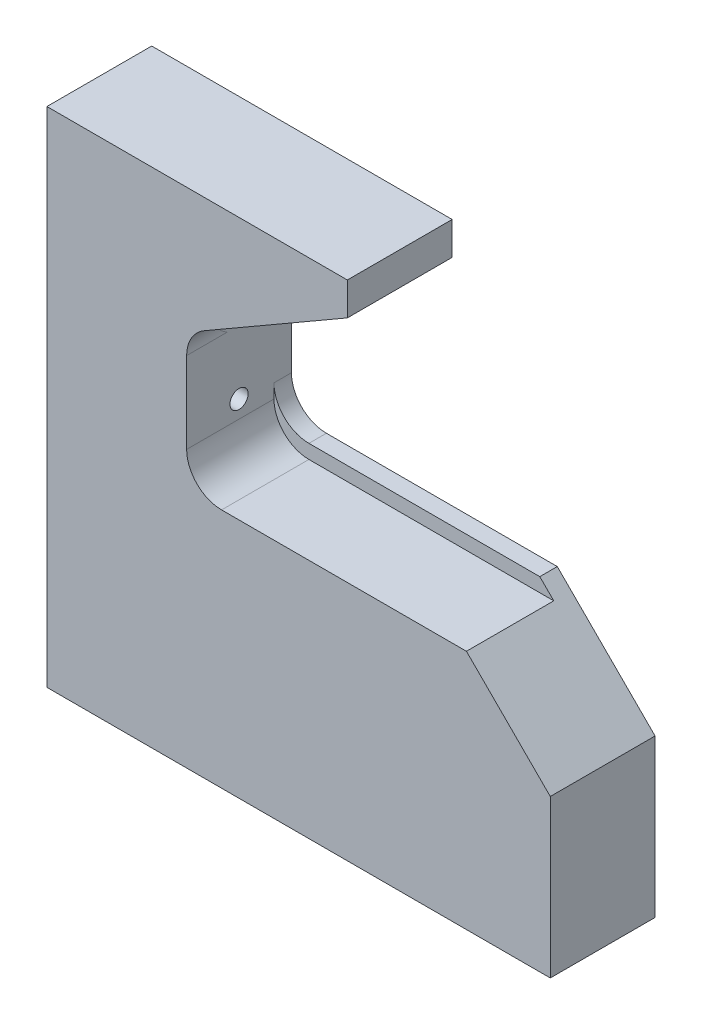
ISO-10303-21;
HEADER;
FILE_DESCRIPTION(('STEP AP214'),'2;1');
FILE_NAME('part.step','',(''),(''),'','','');
FILE_SCHEMA(('AUTOMOTIVE_DESIGN { 1 0 10303 214 1 1 1 1 }'));
ENDSEC;
DATA;
#1=APPLICATION_CONTEXT('core data for automotive mechanical design processes');
#2=APPLICATION_PROTOCOL_DEFINITION('international standard','automotive_design',2000,#1);
#3=PRODUCT_CONTEXT('',#1,'mechanical');
#4=PRODUCT('Part','Part','',(#3));
#5=PRODUCT_RELATED_PRODUCT_CATEGORY('part','',(#4));
#6=PRODUCT_DEFINITION_FORMATION('','',#4);
#7=PRODUCT_DEFINITION_CONTEXT('part definition',#1,'design');
#8=PRODUCT_DEFINITION('design','',#6,#7);
#9=PRODUCT_DEFINITION_SHAPE('','',#8);
#10=(LENGTH_UNIT() NAMED_UNIT(*) SI_UNIT(.MILLI.,.METRE.));
#11=(NAMED_UNIT(*) PLANE_ANGLE_UNIT() SI_UNIT($,.RADIAN.));
#12=(NAMED_UNIT(*) SI_UNIT($,.STERADIAN.) SOLID_ANGLE_UNIT());
#13=UNCERTAINTY_MEASURE_WITH_UNIT(LENGTH_MEASURE(1.E-05),#10,'distance_accuracy_value','');
#14=(GEOMETRIC_REPRESENTATION_CONTEXT(3) GLOBAL_UNCERTAINTY_ASSIGNED_CONTEXT((#13)) GLOBAL_UNIT_ASSIGNED_CONTEXT((#10,
#11,#12)) REPRESENTATION_CONTEXT('',''));
#15=CARTESIAN_POINT('',(0.,0.,0.));
#16=DIRECTION('',(0.,0.,1.));
#17=DIRECTION('',(1.,0.,0.));
#18=AXIS2_PLACEMENT_3D('',#15,#16,#17);
#19=CARTESIAN_POINT('',(-6.29278813620283,-9.525,9.525));
#20=DIRECTION('',(0.,-1.,0.));
#21=DIRECTION('',(0.,0.,1.));
#22=AXIS2_PLACEMENT_3D('',#19,#20,#21);
#23=PLANE('',#22);
#24=DIRECTION('',(-1.,0.,0.));
#25=VECTOR('',#24,1.);
#26=CARTESIAN_POINT('',(0.,-9.525,-6.35));
#27=LINE('',#26,#25);
#28=CARTESIAN_POINT('',(-6.29278813620283,-9.525,-6.34999999999999));
#29=VERTEX_POINT('',#28);
#30=CARTESIAN_POINT('',(-50.8,-9.525,-6.34999999999999));
#31=VERTEX_POINT('',#30);
#32=EDGE_CURVE('E214',#29,#31,#27,.T.);
#33=ORIENTED_EDGE('',*,*,#32,.T.);
#34=DIRECTION('',(0.,0.,-1.));
#35=VECTOR('',#34,1.);
#36=CARTESIAN_POINT('',(-50.8,-9.525,9.525));
#37=LINE('',#36,#35);
#38=CARTESIAN_POINT('',(-50.8,-9.525,9.525));
#39=VERTEX_POINT('',#38);
#40=EDGE_CURVE('E440',#39,#31,#37,.T.);
#41=ORIENTED_EDGE('',*,*,#40,.F.);
#42=DIRECTION('',(-1.,0.,0.));
#43=VECTOR('',#42,1.);
#44=CARTESIAN_POINT('',(-6.29278813620283,-9.525,9.525));
#45=LINE('',#44,#43);
#46=CARTESIAN_POINT('',(-6.29278813620283,-9.525,9.525));
#47=VERTEX_POINT('',#46);
#48=EDGE_CURVE('E378',#47,#39,#45,.T.);
#49=ORIENTED_EDGE('',*,*,#48,.F.);
#50=DIRECTION('',(0.,0.,-1.));
#51=VECTOR('',#50,1.);
#52=CARTESIAN_POINT('',(-6.29278813620283,-9.525,9.525));
#53=LINE('',#52,#51);
#54=EDGE_CURVE('E443',#47,#29,#53,.T.);
#55=ORIENTED_EDGE('',*,*,#54,.T.);
#56=EDGE_LOOP('',(#33,#41,#49,#55));
#57=FACE_BOUND('',#56,.T.);
#58=ADVANCED_FACE('F51',(#57),#23,.F.);
#59=CARTESIAN_POINT('',(-50.8,-3.175,9.525));
#60=DIRECTION('',(0.,0.,-1.));
#61=DIRECTION('',(1.,0.,0.));
#62=AXIS2_PLACEMENT_3D('',#59,#60,#61);
#63=CYLINDRICAL_SURFACE('',#62,6.35);
#64=CARTESIAN_POINT('',(-50.8,-3.175,-6.35));
#65=DIRECTION('',(0.,0.,-1.));
#66=DIRECTION('',(1.,0.,0.));
#67=AXIS2_PLACEMENT_3D('',#64,#65,#66);
#68=CIRCLE('',#67,6.35);
#69=CARTESIAN_POINT('',(-57.15,-3.175,-6.34999999999999));
#70=VERTEX_POINT('',#69);
#71=EDGE_CURVE('E76',#31,#70,#68,.T.);
#72=ORIENTED_EDGE('',*,*,#71,.T.);
#73=DIRECTION('',(0.,0.,-1.));
#74=VECTOR('',#73,1.);
#75=CARTESIAN_POINT('',(-57.15,-3.175,9.525));
#76=LINE('',#75,#74);
#77=CARTESIAN_POINT('',(-57.15,-3.175,9.525));
#78=VERTEX_POINT('',#77);
#79=EDGE_CURVE('E436',#78,#70,#76,.T.);
#80=ORIENTED_EDGE('',*,*,#79,.F.);
#81=CARTESIAN_POINT('',(-50.8,-3.175,9.525));
#82=DIRECTION('',(0.,0.,-1.));
#83=DIRECTION('',(1.,0.,0.));
#84=AXIS2_PLACEMENT_3D('',#81,#82,#83);
#85=CIRCLE('',#84,6.35);
#86=EDGE_CURVE('E382',#39,#78,#85,.T.);
#87=ORIENTED_EDGE('',*,*,#86,.F.);
#88=ORIENTED_EDGE('',*,*,#40,.T.);
#89=EDGE_LOOP('',(#72,#80,#87,#88));
#90=FACE_BOUND('',#89,.T.);
#91=ADVANCED_FACE('F304',(#90),#63,.F.);
#92=CARTESIAN_POINT('',(-50.8,11.593094792873,9.525));
#93=DIRECTION('',(0.,0.,-1.));
#94=DIRECTION('',(1.,0.,0.));
#95=AXIS2_PLACEMENT_3D('',#92,#93,#94);
#96=CYLINDRICAL_SURFACE('',#95,6.35);
#97=CARTESIAN_POINT('',(-53.975,17.0923561069042,4.60428608570136));
#98=CARTESIAN_POINT('',(-54.1113508766374,17.0136414045933,4.62508964887516));
#99=CARTESIAN_POINT('',(-54.2448913914641,16.9297730828273,4.64511225366183));
#100=CARTESIAN_POINT('',(-54.5058268645094,16.751997878483,4.6819390500378));
#101=CARTESIAN_POINT('',(-54.6332137589857,16.6580783163095,4.69873910002061));
#102=CARTESIAN_POINT('',(-54.8818400642926,16.4599753567673,4.72750376481506));
#103=CARTESIAN_POINT('',(-55.003029721475,16.3557241746457,4.73943340216922));
#104=CARTESIAN_POINT('',(-55.2374048178985,16.1381445523192,4.75647541852492));
#105=CARTESIAN_POINT('',(-55.35059476805,16.0248213058547,4.76159166900556));
#106=CARTESIAN_POINT('',(-55.5463264474944,15.8134362028541,4.76302846466305));
#107=CARTESIAN_POINT('',(-55.63046672208,15.7168621875559,4.7609051129015));
#108=CARTESIAN_POINT('',(-55.7925866764744,15.519024406963,4.75021009038339));
#109=CARTESIAN_POINT('',(-55.8705677154356,15.4177616841881,4.74163984667382));
#110=CARTESIAN_POINT('',(-56.0196758943345,15.2116050865912,4.71720819506649));
#111=CARTESIAN_POINT('',(-56.0908230061625,15.1067230909921,4.70136886662639));
#112=CARTESIAN_POINT('',(-56.226094755376,14.8939858242828,4.66162241297098));
#113=CARTESIAN_POINT('',(-56.2902194939784,14.7861305960554,4.63771540405945));
#114=CARTESIAN_POINT('',(-56.4115757674052,14.5677281511387,4.58096849410895));
#115=CARTESIAN_POINT('',(-56.4687496606463,14.4571665022745,4.54806040002896));
#116=CARTESIAN_POINT('',(-56.5754116495449,14.2354894555281,4.4729302555646));
#117=CARTESIAN_POINT('',(-56.6248996425662,14.1243740502716,4.43070808081975));
#118=CARTESIAN_POINT('',(-56.7161808387424,13.9029960870149,4.33671183072896));
#119=CARTESIAN_POINT('',(-56.7579726750404,13.7927336838348,4.2849360619031));
#120=CARTESIAN_POINT('',(-56.8340477039572,13.5745379665484,4.17185512711184));
#121=CARTESIAN_POINT('',(-56.8683315315639,13.4666044561731,4.11055076777488));
#122=CARTESIAN_POINT('',(-56.9264952668409,13.2658985662237,3.98577731950784));
#123=CARTESIAN_POINT('',(-56.9510981150687,13.1727455703258,3.92325300113739));
#124=CARTESIAN_POINT('',(-56.9950956957228,12.9902709148279,3.79109986904151));
#125=CARTESIAN_POINT('',(-57.0144882843248,12.9009508449946,3.72146814709996));
#126=CARTESIAN_POINT('',(-57.0485801618721,12.7269440695261,3.57548014176961));
#127=CARTESIAN_POINT('',(-57.063276399359,12.6422604058874,3.49911952721115));
#128=CARTESIAN_POINT('',(-57.0885466129999,12.4782867137482,3.34017718422799));
#129=CARTESIAN_POINT('',(-57.0991203897732,12.3989969462736,3.2575951551383));
#130=CARTESIAN_POINT('',(-57.1163699495852,12.2498666873862,3.09059466462463));
#131=CARTESIAN_POINT('',(-57.1232004809615,12.1797609557093,3.00642843981754));
#132=CARTESIAN_POINT('',(-57.1342262156432,12.0454423071342,2.83335401028897));
#133=CARTESIAN_POINT('',(-57.13842134248,11.9812295612723,2.74444566805201));
#134=CARTESIAN_POINT('',(-57.1447154769834,11.8592079938995,2.56257298808015));
#135=CARTESIAN_POINT('',(-57.1468193381599,11.8013846224067,2.46961856697297));
#136=CARTESIAN_POINT('',(-57.1494582485168,11.692271159258,2.27995037574595));
#137=CARTESIAN_POINT('',(-57.1499935732039,11.6409799217751,2.18323726884723));
#138=CARTESIAN_POINT('',(-57.15,11.593094792873,2.08487266929629));
#139=B_SPLINE_CURVE_WITH_KNOTS('',3,(#97,#98,#99,#100,#101,#102,#103,#104,#105,#106,#107,#108,
#109,#110,#111,#112,#113,#114,#115,#116,#117,#118,#119,#120,#121,#122,#123,#124,#125,#126,#127,
#128,#129,#130,#131,#132,#133,#134,#135,#136,#137,#138),.UNSPECIFIED.,.F.,.F.,(4,2,2,2,2,2,2,2,
2,2,2,2,2,2,2,2,2,2,2,2,4),(0.,0.476379772374912,0.953367742047326,1.43372342640456,
1.91380604809174,2.29775745889993,2.68162390542814,3.06433201743873,3.44703461255936,
3.83272099070913,4.21841251880887,4.60417248077879,4.98989980458882,5.33407069164746,
5.6783829758579,6.02291852454581,6.36747073444755,6.696430247589,7.02539930533709,
7.35360308069951,7.68174920503093),.UNSPECIFIED.);
#140=CARTESIAN_POINT('',(-53.975,17.0923561069042,4.60428608570136));
#141=VERTEX_POINT('',#140);
#142=CARTESIAN_POINT('',(-57.15,11.593094792873,2.08487266929633));
#143=VERTEX_POINT('',#142);
#144=EDGE_CURVE('E255',#141,#143,#139,.T.);
#145=ORIENTED_EDGE('',*,*,#144,.F.);
#146=DIRECTION('',(0.,0.,-1.));
#147=VECTOR('',#146,1.);
#148=CARTESIAN_POINT('',(-53.975,17.0923561069042,9.525));
#149=LINE('',#148,#147);
#150=CARTESIAN_POINT('',(-53.975,17.0923561069042,9.525));
#151=VERTEX_POINT('',#150);
#152=EDGE_CURVE('E427',#151,#141,#149,.T.);
#153=ORIENTED_EDGE('',*,*,#152,.F.);
#154=CARTESIAN_POINT('',(-50.8,11.593094792873,9.525));
#155=DIRECTION('',(0.,0.,-1.));
#156=DIRECTION('',(1.,0.,0.));
#157=AXIS2_PLACEMENT_3D('',#154,#155,#156);
#158=CIRCLE('',#157,6.35);
#159=CARTESIAN_POINT('',(-57.15,11.593094792873,9.525));
#160=VERTEX_POINT('',#159);
#161=EDGE_CURVE('E389',#160,#151,#158,.T.);
#162=ORIENTED_EDGE('',*,*,#161,.F.);
#163=DIRECTION('',(0.,0.,-1.));
#164=VECTOR('',#163,1.);
#165=CARTESIAN_POINT('',(-57.15,11.593094792873,9.525));
#166=LINE('',#165,#164);
#167=EDGE_CURVE('E432',#160,#143,#166,.T.);
#168=ORIENTED_EDGE('',*,*,#167,.T.);
#169=EDGE_LOOP('',(#145,#153,#162,#168));
#170=FACE_BOUND('',#169,.T.);
#171=ADVANCED_FACE('F261',(#170),#96,.F.);
#172=CARTESIAN_POINT('',(-57.15,11.593094792873,-2.08487266929629));
#173=CARTESIAN_POINT('',(-57.1499896079638,11.6477036663434,-2.19706000854487));
#174=CARTESIAN_POINT('',(-57.149295442611,11.7067505495997,-2.30709883615113));
#175=CARTESIAN_POINT('',(-57.1457738852113,11.8332961099778,-2.52221696693255));
#176=CARTESIAN_POINT('',(-57.1429457661744,11.9007976608766,-2.62729456696358));
#177=CARTESIAN_POINT('',(-57.1343772320195,12.0439969425765,-2.83204549306916));
#178=CARTESIAN_POINT('',(-57.1286284313238,12.1197177767795,-2.93170233840411));
#179=CARTESIAN_POINT('',(-57.1133939144072,12.2786067084437,-3.1245747462868));
#180=CARTESIAN_POINT('',(-57.1039086507198,12.3617739031131,-3.21779108725592));
#181=CARTESIAN_POINT('',(-57.0803422398971,12.5351551675311,-3.39742198609998));
#182=CARTESIAN_POINT('',(-57.0662456746826,12.6253920946448,-3.48381250154185));
#183=CARTESIAN_POINT('',(-57.0326737025964,12.8118004687659,-3.64879482459787));
#184=CARTESIAN_POINT('',(-57.0131986386591,12.9079715371075,-3.72738712899368));
#185=CARTESIAN_POINT('',(-56.9682029671152,13.105035044801,-3.87606811093338));
#186=CARTESIAN_POINT('',(-56.9426946275755,13.2059175740881,-3.94617361383919));
#187=CARTESIAN_POINT('',(-56.8850298855865,13.4114166067748,-4.07762639548657));
#188=CARTESIAN_POINT('',(-56.8528740234818,13.5160328061112,-4.13897438539856));
#189=CARTESIAN_POINT('',(-56.7837993636749,13.7209030425351,-4.24898938784659));
#190=CARTESIAN_POINT('',(-56.7473205959476,13.8210041883582,-4.29821858822719));
#191=CARTESIAN_POINT('',(-56.667991249007,14.0222666730337,-4.388730959138));
#192=CARTESIAN_POINT('',(-56.6251407773086,14.1234279939702,-4.43001426371868));
#193=CARTESIAN_POINT('',(-56.5330307643795,14.3257142433685,-4.50474723452688));
#194=CARTESIAN_POINT('',(-56.4837714841317,14.4268391731441,-4.53819721959182));
#195=CARTESIAN_POINT('',(-56.3789415530392,14.6280210493351,-4.59754832087161));
#196=CARTESIAN_POINT('',(-56.3233708178056,14.7280779814509,-4.62344933613449));
#197=CARTESIAN_POINT('',(-56.2072051739229,14.9243711737376,-4.66772436778048));
#198=CARTESIAN_POINT('',(-56.1467204143452,15.0206438347441,-4.68622707799075));
#199=CARTESIAN_POINT('',(-56.0201375267892,15.2105094311678,-4.71689631806553));
#200=CARTESIAN_POINT('',(-55.9540373588998,15.3041013761087,-4.72906053379707));
#201=CARTESIAN_POINT('',(-55.8164373546782,15.4881018931541,-4.74766096999691));
#202=CARTESIAN_POINT('',(-55.7449270649016,15.5785037805681,-4.75408577746614));
#203=CARTESIAN_POINT('',(-55.5969704685222,15.7554114050622,-4.76182187389247));
#204=CARTESIAN_POINT('',(-55.5205232138835,15.8419163883809,-4.76313217773545));
#205=CARTESIAN_POINT('',(-55.3341426601427,16.0415685182146,-4.76098271199396));
#206=CARTESIAN_POINT('',(-55.2222163043403,16.1528425293162,-4.75559591355604));
#207=CARTESIAN_POINT('',(-54.9906261357071,16.3665643544675,-4.73827779863016));
#208=CARTESIAN_POINT('',(-54.8709575192208,16.469006595147,-4.7263423840558));
#209=CARTESIAN_POINT('',(-54.6253315513067,16.6639723997066,-4.69772225277613));
#210=CARTESIAN_POINT('',(-54.4994083562844,16.7565426640819,-4.68106139941843));
#211=CARTESIAN_POINT('',(-54.2415651757743,16.931860831255,-4.64461374801886));
#212=CARTESIAN_POINT('',(-54.1096531502128,17.0146212728601,-4.6248310174482));
#213=CARTESIAN_POINT('',(-53.975,17.0923561069042,-4.60428608570135));
#214=B_SPLINE_CURVE_WITH_KNOTS('',3,(#172,#173,#174,#175,#176,#177,#178,#179,#180,#181,#182,
#183,#184,#185,#186,#187,#188,#189,#190,#191,#192,#193,#194,#195,#196,#197,#198,#199,#200,#201,
#202,#203,#204,#205,#206,#207,#208,#209,#210,#211,#212,#213),.UNSPECIFIED.,.F.,.F.,(4,2,2,2,2,2,
2,2,2,2,2,2,2,2,2,2,2,2,2,2,4),(0.,0.374235461788785,0.748598474752093,1.12404244831308,
1.49944096476456,1.87610769504882,2.25275041451625,2.6286337546583,3.00448655309735,
3.35613717554868,3.70778186499156,4.05941223904992,4.41104731522638,4.75626757537123,
5.10161378448363,5.44764520681056,5.79374327560947,6.26685501178745,6.74026315682248,
7.21132191576781,7.68177192717215),.UNSPECIFIED.);
#215=CARTESIAN_POINT('',(-57.15,11.593094792873,-2.08487266929633));
#216=VERTEX_POINT('',#215);
#217=CARTESIAN_POINT('',(-53.975,17.0923561069042,-4.60428608570135));
#218=VERTEX_POINT('',#217);
#219=EDGE_CURVE('E245',#216,#218,#214,.T.);
#220=ORIENTED_EDGE('',*,*,#219,.F.);
#221=CARTESIAN_POINT('',(-57.15,11.593094792873,-9.525));
#222=VERTEX_POINT('',#221);
#223=EDGE_CURVE('E431',#216,#222,#166,.T.);
#224=ORIENTED_EDGE('',*,*,#223,.T.);
#225=CARTESIAN_POINT('',(-50.8,11.593094792873,-9.525));
#226=DIRECTION('',(0.,0.,-1.));
#227=DIRECTION('',(1.,0.,0.));
#228=AXIS2_PLACEMENT_3D('',#225,#226,#227);
#229=CIRCLE('',#228,6.35);
#230=CARTESIAN_POINT('',(-53.975,17.0923561069042,-9.525));
#231=VERTEX_POINT('',#230);
#232=EDGE_CURVE('E409',#222,#231,#229,.T.);
#233=ORIENTED_EDGE('',*,*,#232,.T.);
#234=EDGE_CURVE('E426',#218,#231,#149,.T.);
#235=ORIENTED_EDGE('',*,*,#234,.F.);
#236=EDGE_LOOP('',(#220,#224,#233,#235));
#237=FACE_BOUND('',#236,.T.);
#238=ADVANCED_FACE('F327',(#237),#96,.F.);
#239=CARTESIAN_POINT('',(-27.94,38.1,9.525));
#240=DIRECTION('',(0.,-1.,0.));
#241=DIRECTION('',(0.,0.,1.));
#242=AXIS2_PLACEMENT_3D('',#239,#240,#241);
#243=PLANE('',#242);
#244=DIRECTION('',(-1.,0.,0.));
#245=VECTOR('',#244,1.);
#246=CARTESIAN_POINT('',(-27.94,38.1,-9.525));
#247=LINE('',#246,#245);
#248=CARTESIAN_POINT('',(-27.94,38.1,-9.525));
#249=VERTEX_POINT('',#248);
#250=CARTESIAN_POINT('',(-82.55,38.1,-9.525));
#251=VERTEX_POINT('',#250);
#252=EDGE_CURVE('E345',#249,#251,#247,.T.);
#253=ORIENTED_EDGE('',*,*,#252,.T.);
#254=DIRECTION('',(0.,0.,-1.));
#255=VECTOR('',#254,1.);
#256=CARTESIAN_POINT('',(-82.55,38.1,9.525));
#257=LINE('',#256,#255);
#258=CARTESIAN_POINT('',(-82.55,38.1,9.525));
#259=VERTEX_POINT('',#258);
#260=EDGE_CURVE('E61',#259,#251,#257,.T.);
#261=ORIENTED_EDGE('',*,*,#260,.F.);
#262=DIRECTION('',(-1.,0.,0.));
#263=VECTOR('',#262,1.);
#264=CARTESIAN_POINT('',(-27.94,38.1,9.525));
#265=LINE('',#264,#263);
#266=CARTESIAN_POINT('',(-27.94,38.1,9.525));
#267=VERTEX_POINT('',#266);
#268=EDGE_CURVE('E367',#267,#259,#265,.T.);
#269=ORIENTED_EDGE('',*,*,#268,.F.);
#270=DIRECTION('',(0.,0.,-1.));
#271=VECTOR('',#270,1.);
#272=CARTESIAN_POINT('',(-27.94,38.1,9.525));
#273=LINE('',#272,#271);
#274=EDGE_CURVE('E400',#267,#249,#273,.T.);
#275=ORIENTED_EDGE('',*,*,#274,.T.);
#276=EDGE_LOOP('',(#253,#261,#269,#275));
#277=FACE_BOUND('',#276,.T.);
#278=ADVANCED_FACE('F53',(#277),#243,.F.);
#279=CARTESIAN_POINT('',(-82.55,38.1,9.525));
#280=DIRECTION('',(1.,0.,0.));
#281=DIRECTION('',(0.,0.,1.));
#282=AXIS2_PLACEMENT_3D('',#279,#280,#281);
#283=PLANE('',#282);
#284=CARTESIAN_POINT('',(-82.55,0.,0.));
#285=DIRECTION('',(-1.,0.,0.));
#286=DIRECTION('',(0.,0.,1.));
#287=AXIS2_PLACEMENT_3D('',#284,#285,#286);
#288=CIRCLE('',#287,1.64999999999999);
#289=CARTESIAN_POINT('',(-82.55,0.,1.64999999999999));
#290=VERTEX_POINT('',#289);
#291=EDGE_CURVE('E332',#290,#290,#288,.T.);
#292=ORIENTED_EDGE('',*,*,#291,.F.);
#293=EDGE_LOOP('',(#292));
#294=FACE_BOUND('',#293,.T.);
#295=CARTESIAN_POINT('',(-82.55,15.875,0.));
#296=DIRECTION('',(-1.,0.,0.));
#297=DIRECTION('',(0.,0.,-1.));
#298=AXIS2_PLACEMENT_3D('',#295,#296,#297);
#299=CIRCLE('',#298,2.925);
#300=CARTESIAN_POINT('',(-82.55,15.875,-2.925));
#301=VERTEX_POINT('',#300);
#302=EDGE_CURVE('E336',#301,#301,#299,.T.);
#303=ORIENTED_EDGE('',*,*,#302,.F.);
#304=EDGE_LOOP('',(#303));
#305=FACE_BOUND('',#304,.T.);
#306=DIRECTION('',(0.,-1.,0.));
#307=VECTOR('',#306,1.);
#308=CARTESIAN_POINT('',(-82.55,38.1,-9.525));
#309=LINE('',#308,#307);
#310=CARTESIAN_POINT('',(-82.55,-53.34,-9.525));
#311=VERTEX_POINT('',#310);
#312=EDGE_CURVE('E339',#251,#311,#309,.T.);
#313=ORIENTED_EDGE('',*,*,#312,.T.);
#314=DIRECTION('',(0.,0.,-1.));
#315=VECTOR('',#314,1.);
#316=CARTESIAN_POINT('',(-82.55,-53.34,105.009568406882));
#317=LINE('',#316,#315);
#318=CARTESIAN_POINT('',(-82.55,-53.34,9.52500000000001));
#319=VERTEX_POINT('',#318);
#320=EDGE_CURVE('E199',#319,#311,#317,.T.);
#321=ORIENTED_EDGE('',*,*,#320,.F.);
#322=DIRECTION('',(0.,-1.,0.));
#323=VECTOR('',#322,1.);
#324=CARTESIAN_POINT('',(-82.55,38.1,9.525));
#325=LINE('',#324,#323);
#326=EDGE_CURVE('E363',#259,#319,#325,.T.);
#327=ORIENTED_EDGE('',*,*,#326,.F.);
#328=ORIENTED_EDGE('',*,*,#260,.T.);
#329=EDGE_LOOP('',(#313,#321,#327,#328));
#330=FACE_BOUND('',#329,.T.);
#331=ADVANCED_FACE('F318',(#294,#305,#330),#283,.F.);
#332=CARTESIAN_POINT('',(8.94721186379732,-26.035,9.525));
#333=DIRECTION('',(-1.,0.,0.));
#334=DIRECTION('',(0.,-1.,0.));
#335=AXIS2_PLACEMENT_3D('',#332,#333,#334);
#336=PLANE('',#335);
#337=DIRECTION('',(0.,1.,0.));
#338=VECTOR('',#337,1.);
#339=CARTESIAN_POINT('',(8.94721186379732,-26.035,-9.525));
#340=LINE('',#339,#338);
#341=CARTESIAN_POINT('',(8.94721186379733,-53.34,-9.525));
#342=VERTEX_POINT('',#341);
#343=CARTESIAN_POINT('',(8.94721186379732,-24.765,-9.525));
#344=VERTEX_POINT('',#343);
#345=EDGE_CURVE('E344',#342,#344,#340,.T.);
#346=ORIENTED_EDGE('',*,*,#345,.T.);
#347=DIRECTION('',(0.,0.,-1.));
#348=VECTOR('',#347,1.);
#349=CARTESIAN_POINT('',(8.94721186379732,-24.765,9.525));
#350=LINE('',#349,#348);
#351=CARTESIAN_POINT('',(8.94721186379732,-24.765,9.525));
#352=VERTEX_POINT('',#351);
#353=EDGE_CURVE('E360',#352,#344,#350,.T.);
#354=ORIENTED_EDGE('',*,*,#353,.F.);
#355=DIRECTION('',(0.,1.,0.));
#356=VECTOR('',#355,1.);
#357=CARTESIAN_POINT('',(8.94721186379732,-26.035,9.525));
#358=LINE('',#357,#356);
#359=CARTESIAN_POINT('',(8.94721186379733,-53.34,9.52500000000001));
#360=VERTEX_POINT('',#359);
#361=EDGE_CURVE('E359',#360,#352,#358,.T.);
#362=ORIENTED_EDGE('',*,*,#361,.F.);
#363=DIRECTION('',(0.,0.,-1.));
#364=VECTOR('',#363,1.);
#365=CARTESIAN_POINT('',(8.94721186379733,-53.34,105.009568406882));
#366=LINE('',#365,#364);
#367=EDGE_CURVE('E188',#360,#342,#366,.T.);
#368=ORIENTED_EDGE('',*,*,#367,.T.);
#369=EDGE_LOOP('',(#346,#354,#362,#368));
#370=FACE_BOUND('',#369,.T.);
#371=ADVANCED_FACE('F316',(#370),#336,.F.);
#372=CARTESIAN_POINT('',(8.94721186379732,-24.765,9.525));
#373=DIRECTION('',(-0.707106781186544,-0.707106781186551,0.));
#374=DIRECTION('',(0.707106781186551,-0.707106781186544,0.));
#375=AXIS2_PLACEMENT_3D('',#372,#373,#374);
#376=PLANE('',#375);
#377=DIRECTION('',(-0.707106781186551,0.707106781186544,0.));
#378=VECTOR('',#377,1.);
#379=CARTESIAN_POINT('',(8.94721186379732,-24.765,-9.525));
#380=LINE('',#379,#378);
#381=CARTESIAN_POINT('',(-8.83278813620267,-6.985,-9.52500000000001));
#382=VERTEX_POINT('',#381);
#383=EDGE_CURVE('E353',#344,#382,#380,.T.);
#384=ORIENTED_EDGE('',*,*,#383,.T.);
#385=DIRECTION('',(0.,0.,1.));
#386=VECTOR('',#385,1.);
#387=CARTESIAN_POINT('',(-8.83278813620267,-6.985,-61.1533652516633));
#388=LINE('',#387,#386);
#389=CARTESIAN_POINT('',(-8.83278813620267,-6.985,-6.35));
#390=VERTEX_POINT('',#389);
#391=EDGE_CURVE('E210',#382,#390,#388,.T.);
#392=ORIENTED_EDGE('',*,*,#391,.T.);
#393=DIRECTION('',(0.707106781186525,-0.70710678118657,0.));
#394=VECTOR('',#393,1.);
#395=CARTESIAN_POINT('',(-7.90889406810161,-7.90889406810112,-6.35));
#396=LINE('',#395,#394);
#397=EDGE_CURVE('E68',#390,#29,#396,.T.);
#398=ORIENTED_EDGE('',*,*,#397,.T.);
#399=ORIENTED_EDGE('',*,*,#54,.F.);
#400=DIRECTION('',(-0.707106781186551,0.707106781186544,0.));
#401=VECTOR('',#400,1.);
#402=CARTESIAN_POINT('',(8.94721186379732,-24.765,9.525));
#403=LINE('',#402,#401);
#404=EDGE_CURVE('E362',#352,#47,#403,.T.);
#405=ORIENTED_EDGE('',*,*,#404,.F.);
#406=ORIENTED_EDGE('',*,*,#353,.T.);
#407=EDGE_LOOP('',(#384,#392,#398,#399,#405,#406));
#408=FACE_BOUND('',#407,.T.);
#409=ADVANCED_FACE('F301',(#408),#376,.F.);
#410=CARTESIAN_POINT('',(-57.15,-3.175,9.525));
#411=DIRECTION('',(-1.,0.,0.));
#412=DIRECTION('',(0.,0.,-1.));
#413=AXIS2_PLACEMENT_3D('',#410,#411,#412);
#414=PLANE('',#413);
#415=CARTESIAN_POINT('',(-57.15,0.,0.));
#416=DIRECTION('',(-1.,0.,0.));
#417=DIRECTION('',(0.,0.,1.));
#418=AXIS2_PLACEMENT_3D('',#415,#416,#417);
#419=CIRCLE('',#418,1.64999999999998);
#420=CARTESIAN_POINT('',(-57.15,0.,1.64999999999998));
#421=VERTEX_POINT('',#420);
#422=EDGE_CURVE('E55',#421,#421,#419,.T.);
#423=ORIENTED_EDGE('',*,*,#422,.T.);
#424=EDGE_LOOP('',(#423));
#425=FACE_BOUND('',#424,.T.);
#426=DIRECTION('',(0.,1.,0.));
#427=VECTOR('',#426,1.);
#428=CARTESIAN_POINT('',(-57.15,-1.56125112837913E-13,-6.35));
#429=LINE('',#428,#427);
#430=CARTESIAN_POINT('',(-57.15,-0.635000000000004,-6.35));
#431=VERTEX_POINT('',#430);
#432=EDGE_CURVE('E220',#70,#431,#429,.T.);
#433=ORIENTED_EDGE('',*,*,#432,.T.);
#434=DIRECTION('',(0.,0.,1.));
#435=VECTOR('',#434,1.);
#436=CARTESIAN_POINT('',(-57.15,-0.635000000000004,-61.1533652516633));
#437=LINE('',#436,#435);
#438=CARTESIAN_POINT('',(-57.15,-0.635000000000004,-9.525));
#439=VERTEX_POINT('',#438);
#440=EDGE_CURVE('E233',#439,#431,#437,.T.);
#441=ORIENTED_EDGE('',*,*,#440,.F.);
#442=DIRECTION('',(0.,1.,0.));
#443=VECTOR('',#442,1.);
#444=CARTESIAN_POINT('',(-57.15,-3.175,-9.525));
#445=LINE('',#444,#443);
#446=EDGE_CURVE('E406',#439,#222,#445,.T.);
#447=ORIENTED_EDGE('',*,*,#446,.T.);
#448=ORIENTED_EDGE('',*,*,#223,.F.);
#449=CARTESIAN_POINT('',(-57.15,15.875,0.));
#450=DIRECTION('',(-1.,0.,0.));
#451=DIRECTION('',(0.,0.,-1.));
#452=AXIS2_PLACEMENT_3D('',#449,#450,#451);
#453=CIRCLE('',#452,4.7625);
#454=EDGE_CURVE('E230',#143,#216,#453,.T.);
#455=ORIENTED_EDGE('',*,*,#454,.F.);
#456=ORIENTED_EDGE('',*,*,#167,.F.);
#457=DIRECTION('',(0.,1.,0.));
#458=VECTOR('',#457,1.);
#459=CARTESIAN_POINT('',(-57.15,-3.175,9.525));
#460=LINE('',#459,#458);
#461=EDGE_CURVE('E386',#78,#160,#460,.T.);
#462=ORIENTED_EDGE('',*,*,#461,.F.);
#463=ORIENTED_EDGE('',*,*,#79,.T.);
#464=EDGE_LOOP('',(#433,#441,#447,#448,#455,#456,#462,#463));
#465=FACE_BOUND('',#464,.T.);
#466=CARTESIAN_POINT('',(-57.15,15.875,0.));
#467=DIRECTION('',(-1.,0.,0.));
#468=DIRECTION('',(0.,0.,-1.));
#469=AXIS2_PLACEMENT_3D('',#466,#467,#468);
#470=CIRCLE('',#469,2.89999999999998);
#471=CARTESIAN_POINT('',(-57.15,15.875,-2.89999999999998));
#472=VERTEX_POINT('',#471);
#473=EDGE_CURVE('E244',#472,#472,#470,.F.);
#474=ORIENTED_EDGE('',*,*,#473,.F.);
#475=EDGE_LOOP('',(#474));
#476=FACE_BOUND('',#475,.T.);
#477=ADVANCED_FACE('F295',(#425,#465,#476),#414,.F.);
#478=CARTESIAN_POINT('',(-53.975,17.0923561069042,9.525));
#479=DIRECTION('',(-0.500000000000001,0.866025403784438,0.));
#480=DIRECTION('',(-0.866025403784438,-0.500000000000001,0.));
#481=AXIS2_PLACEMENT_3D('',#478,#479,#480);
#482=PLANE('',#481);
#483=CARTESIAN_POINT('',(-56.0835226280623,15.875,0.));
#484=DIRECTION('',(-0.500000000000001,0.866025403784438,0.));
#485=DIRECTION('',(0.866025403784438,0.500000000000001,0.));
#486=AXIS2_PLACEMENT_3D('',#483,#484,#485);
#487=ELLIPSE('',#486,9.52499999999998,4.7625);
#488=EDGE_CURVE('E11',#218,#141,#487,.F.);
#489=ORIENTED_EDGE('',*,*,#488,.F.);
#490=ORIENTED_EDGE('',*,*,#234,.T.);
#491=DIRECTION('',(0.866025403784438,0.500000000000001,0.));
#492=VECTOR('',#491,1.);
#493=CARTESIAN_POINT('',(-53.975,17.0923561069042,-9.525));
#494=LINE('',#493,#492);
#495=CARTESIAN_POINT('',(-27.94,32.1236703652562,-9.525));
#496=VERTEX_POINT('',#495);
#497=EDGE_CURVE('E413',#231,#496,#494,.T.);
#498=ORIENTED_EDGE('',*,*,#497,.T.);
#499=DIRECTION('',(0.,0.,-1.));
#500=VECTOR('',#499,1.);
#501=CARTESIAN_POINT('',(-27.94,32.1236703652562,9.525));
#502=LINE('',#501,#500);
#503=CARTESIAN_POINT('',(-27.94,32.1236703652562,9.525));
#504=VERTEX_POINT('',#503);
#505=EDGE_CURVE('E422',#504,#496,#502,.T.);
#506=ORIENTED_EDGE('',*,*,#505,.F.);
#507=DIRECTION('',(0.866025403784438,0.500000000000001,0.));
#508=VECTOR('',#507,1.);
#509=CARTESIAN_POINT('',(-53.975,17.0923561069042,9.525));
#510=LINE('',#509,#508);
#511=EDGE_CURVE('E393',#151,#504,#510,.T.);
#512=ORIENTED_EDGE('',*,*,#511,.F.);
#513=ORIENTED_EDGE('',*,*,#152,.T.);
#514=EDGE_LOOP('',(#489,#490,#498,#506,#512,#513));
#515=FACE_BOUND('',#514,.T.);
#516=ADVANCED_FACE('F292',(#515),#482,.F.);
#517=CARTESIAN_POINT('',(-27.94,32.1236703652562,9.525));
#518=DIRECTION('',(-1.,0.,0.));
#519=DIRECTION('',(0.,-1.,0.));
#520=AXIS2_PLACEMENT_3D('',#517,#518,#519);
#521=PLANE('',#520);
#522=DIRECTION('',(0.,1.,0.));
#523=VECTOR('',#522,1.);
#524=CARTESIAN_POINT('',(-27.94,32.1236703652562,-9.525));
#525=LINE('',#524,#523);
#526=EDGE_CURVE('E372',#496,#249,#525,.T.);
#527=ORIENTED_EDGE('',*,*,#526,.T.);
#528=ORIENTED_EDGE('',*,*,#274,.F.);
#529=DIRECTION('',(0.,1.,0.));
#530=VECTOR('',#529,1.);
#531=CARTESIAN_POINT('',(-27.94,32.1236703652562,9.525));
#532=LINE('',#531,#530);
#533=EDGE_CURVE('E397',#504,#267,#532,.T.);
#534=ORIENTED_EDGE('',*,*,#533,.F.);
#535=ORIENTED_EDGE('',*,*,#505,.T.);
#536=EDGE_LOOP('',(#527,#528,#534,#535));
#537=FACE_BOUND('',#536,.T.);
#538=ADVANCED_FACE('F286',(#537),#521,.F.);
#539=CARTESIAN_POINT('',(-50.8,-3.175,9.525));
#540=DIRECTION('',(0.,0.,-1.));
#541=DIRECTION('',(1.,0.,0.));
#542=AXIS2_PLACEMENT_3D('',#539,#540,#541);
#543=PLANE('',#542);
#544=ORIENTED_EDGE('',*,*,#268,.T.);
#545=ORIENTED_EDGE('',*,*,#326,.T.);
#546=DIRECTION('',(1.,0.,0.));
#547=VECTOR('',#546,1.);
#548=CARTESIAN_POINT('',(-50.8,-53.34,9.52500000000001));
#549=LINE('',#548,#547);
#550=EDGE_CURVE('E195',#319,#360,#549,.T.);
#551=ORIENTED_EDGE('',*,*,#550,.T.);
#552=ORIENTED_EDGE('',*,*,#361,.T.);
#553=ORIENTED_EDGE('',*,*,#404,.T.);
#554=ORIENTED_EDGE('',*,*,#48,.T.);
#555=ORIENTED_EDGE('',*,*,#86,.T.);
#556=ORIENTED_EDGE('',*,*,#461,.T.);
#557=ORIENTED_EDGE('',*,*,#161,.T.);
#558=ORIENTED_EDGE('',*,*,#511,.T.);
#559=ORIENTED_EDGE('',*,*,#533,.T.);
#560=EDGE_LOOP('',(#544,#545,#551,#552,#553,#554,#555,#556,#557,#558,#559));
#561=FACE_BOUND('',#560,.T.);
#562=ADVANCED_FACE('F283',(#561),#543,.F.);
#563=CARTESIAN_POINT('',(-50.8,-3.175,-9.525));
#564=DIRECTION('',(0.,0.,-1.));
#565=DIRECTION('',(1.,0.,0.));
#566=AXIS2_PLACEMENT_3D('',#563,#564,#565);
#567=PLANE('',#566);
#568=ORIENTED_EDGE('',*,*,#252,.F.);
#569=ORIENTED_EDGE('',*,*,#526,.F.);
#570=ORIENTED_EDGE('',*,*,#497,.F.);
#571=ORIENTED_EDGE('',*,*,#232,.F.);
#572=ORIENTED_EDGE('',*,*,#446,.F.);
#573=CARTESIAN_POINT('',(-50.8,-0.635000000000004,-9.525));
#574=DIRECTION('',(0.,0.,-1.));
#575=DIRECTION('',(1.,0.,0.));
#576=AXIS2_PLACEMENT_3D('',#573,#574,#575);
#577=CIRCLE('',#576,6.35);
#578=CARTESIAN_POINT('',(-50.8,-6.985,-9.52500000000001));
#579=VERTEX_POINT('',#578);
#580=EDGE_CURVE('E198',#579,#439,#577,.T.);
#581=ORIENTED_EDGE('',*,*,#580,.F.);
#582=DIRECTION('',(1.,0.,0.));
#583=VECTOR('',#582,1.);
#584=CARTESIAN_POINT('',(0.,-6.985,-9.525));
#585=LINE('',#584,#583);
#586=EDGE_CURVE('E227',#579,#382,#585,.T.);
#587=ORIENTED_EDGE('',*,*,#586,.T.);
#588=ORIENTED_EDGE('',*,*,#383,.F.);
#589=ORIENTED_EDGE('',*,*,#345,.F.);
#590=DIRECTION('',(-1.,0.,0.));
#591=VECTOR('',#590,1.);
#592=CARTESIAN_POINT('',(-50.8,-53.34,-9.525));
#593=LINE('',#592,#591);
#594=EDGE_CURVE('E180',#342,#311,#593,.T.);
#595=ORIENTED_EDGE('',*,*,#594,.T.);
#596=ORIENTED_EDGE('',*,*,#312,.F.);
#597=EDGE_LOOP('',(#568,#569,#570,#571,#572,#581,#587,#588,#589,#595,#596));
#598=FACE_BOUND('',#597,.T.);
#599=ADVANCED_FACE('F281',(#598),#567,.T.);
#600=CARTESIAN_POINT('',(-82.55,15.875,0.));
#601=DIRECTION('',(-1.,0.,0.));
#602=DIRECTION('',(0.,0.,-1.));
#603=AXIS2_PLACEMENT_3D('',#600,#601,#602);
#604=CYLINDRICAL_SURFACE('',#603,2.89999999999998);
#605=ORIENTED_EDGE('',*,*,#473,.T.);
#606=EDGE_LOOP('',(#605));
#607=FACE_BOUND('',#606,.T.);
#608=CARTESIAN_POINT('',(-82.525,15.875,0.));
#609=DIRECTION('',(-1.,0.,0.));
#610=DIRECTION('',(0.,0.,-1.));
#611=AXIS2_PLACEMENT_3D('',#608,#609,#610);
#612=CIRCLE('',#611,2.89999999999998);
#613=CARTESIAN_POINT('',(-82.525,15.875,-2.89999999999998));
#614=VERTEX_POINT('',#613);
#615=EDGE_CURVE('E402',#614,#614,#612,.T.);
#616=ORIENTED_EDGE('',*,*,#615,.T.);
#617=EDGE_LOOP('',(#616));
#618=FACE_BOUND('',#617,.T.);
#619=ADVANCED_FACE('F277',(#607,#618),#604,.F.);
#620=CARTESIAN_POINT('',(-82.55,15.875,0.));
#621=DIRECTION('',(-1.,0.,0.));
#622=DIRECTION('',(0.,0.,-1.));
#623=AXIS2_PLACEMENT_3D('',#620,#621,#622);
#624=CONICAL_SURFACE('',#623,2.925,0.785398163397275);
#625=ORIENTED_EDGE('',*,*,#615,.F.);
#626=EDGE_LOOP('',(#625));
#627=FACE_BOUND('',#626,.T.);
#628=ORIENTED_EDGE('',*,*,#302,.T.);
#629=EDGE_LOOP('',(#628));
#630=FACE_BOUND('',#629,.T.);
#631=ADVANCED_FACE('F271',(#627,#630),#624,.F.);
#632=CARTESIAN_POINT('',(-70.6203841816037,15.875,0.));
#633=DIRECTION('',(1.,0.,0.));
#634=DIRECTION('',(0.,0.,1.));
#635=AXIS2_PLACEMENT_3D('',#632,#633,#634);
#636=CYLINDRICAL_SURFACE('',#635,4.7625);
#637=ORIENTED_EDGE('',*,*,#144,.T.);
#638=ORIENTED_EDGE('',*,*,#454,.T.);
#639=ORIENTED_EDGE('',*,*,#219,.T.);
#640=ORIENTED_EDGE('',*,*,#488,.T.);
#641=EDGE_LOOP('',(#637,#638,#639,#640));
#642=FACE_BOUND('',#641,.T.);
#643=ADVANCED_FACE('F265',(#642),#636,.F.);
#644=CARTESIAN_POINT('',(-50.8,-0.635000000000004,-61.1533652516633));
#645=DIRECTION('',(0.,0.,1.));
#646=DIRECTION('',(-1.,0.,0.));
#647=AXIS2_PLACEMENT_3D('',#644,#645,#646);
#648=CYLINDRICAL_SURFACE('',#647,6.35);
#649=DIRECTION('',(0.,0.,1.));
#650=VECTOR('',#649,1.);
#651=CARTESIAN_POINT('',(-50.8,-6.985,-61.1533652516633));
#652=LINE('',#651,#650);
#653=CARTESIAN_POINT('',(-50.8,-6.985,-6.35));
#654=VERTEX_POINT('',#653);
#655=EDGE_CURVE('E211',#579,#654,#652,.T.);
#656=ORIENTED_EDGE('',*,*,#655,.F.);
#657=ORIENTED_EDGE('',*,*,#580,.T.);
#658=ORIENTED_EDGE('',*,*,#440,.T.);
#659=CARTESIAN_POINT('',(-50.8,-0.635000000000004,-6.35));
#660=DIRECTION('',(0.,0.,-1.));
#661=DIRECTION('',(1.,0.,0.));
#662=AXIS2_PLACEMENT_3D('',#659,#660,#661);
#663=CIRCLE('',#662,6.35);
#664=EDGE_CURVE('E224',#654,#431,#663,.T.);
#665=ORIENTED_EDGE('',*,*,#664,.F.);
#666=EDGE_LOOP('',(#656,#657,#658,#665));
#667=FACE_BOUND('',#666,.T.);
#668=ADVANCED_FACE('F270',(#667),#648,.F.);
#669=CARTESIAN_POINT('',(0.,-6.985,-61.1533652516633));
#670=DIRECTION('',(0.,-1.,0.));
#671=DIRECTION('',(0.,0.,1.));
#672=AXIS2_PLACEMENT_3D('',#669,#670,#671);
#673=PLANE('',#672);
#674=ORIENTED_EDGE('',*,*,#586,.F.);
#675=ORIENTED_EDGE('',*,*,#655,.T.);
#676=DIRECTION('',(1.,0.,0.));
#677=VECTOR('',#676,1.);
#678=CARTESIAN_POINT('',(0.,-6.985,-6.35));
#679=LINE('',#678,#677);
#680=EDGE_CURVE('E207',#654,#390,#679,.T.);
#681=ORIENTED_EDGE('',*,*,#680,.T.);
#682=ORIENTED_EDGE('',*,*,#391,.F.);
#683=EDGE_LOOP('',(#674,#675,#681,#682));
#684=FACE_BOUND('',#683,.T.);
#685=ADVANCED_FACE('F508',(#684),#673,.F.);
#686=CARTESIAN_POINT('',(-50.8,-0.635000000000004,-6.35));
#687=DIRECTION('',(0.,0.,-1.));
#688=DIRECTION('',(1.,0.,0.));
#689=AXIS2_PLACEMENT_3D('',#686,#687,#688);
#690=PLANE('',#689);
#691=ORIENTED_EDGE('',*,*,#664,.T.);
#692=ORIENTED_EDGE('',*,*,#432,.F.);
#693=ORIENTED_EDGE('',*,*,#71,.F.);
#694=ORIENTED_EDGE('',*,*,#32,.F.);
#695=ORIENTED_EDGE('',*,*,#397,.F.);
#696=ORIENTED_EDGE('',*,*,#680,.F.);
#697=EDGE_LOOP('',(#691,#692,#693,#694,#695,#696));
#698=FACE_BOUND('',#697,.T.);
#699=ADVANCED_FACE('F502',(#698),#690,.F.);
#700=CARTESIAN_POINT('',(-50.8,-53.34,105.009568406882));
#701=DIRECTION('',(0.,-1.,0.));
#702=DIRECTION('',(1.,0.,0.));
#703=AXIS2_PLACEMENT_3D('',#700,#701,#702);
#704=PLANE('',#703);
#705=CARTESIAN_POINT('',(-50.8,-53.34,0.));
#706=DIRECTION('',(0.,-1.,0.));
#707=DIRECTION('',(0.,0.,-1.));
#708=AXIS2_PLACEMENT_3D('',#705,#706,#707);
#709=CIRCLE('',#708,2.525);
#710=CARTESIAN_POINT('',(-50.8,-53.34,-2.525));
#711=VERTEX_POINT('',#710);
#712=EDGE_CURVE('E191',#711,#711,#709,.T.);
#713=ORIENTED_EDGE('',*,*,#712,.F.);
#714=EDGE_LOOP('',(#713));
#715=FACE_BOUND('',#714,.T.);
#716=ORIENTED_EDGE('',*,*,#550,.F.);
#717=ORIENTED_EDGE('',*,*,#320,.T.);
#718=ORIENTED_EDGE('',*,*,#594,.F.);
#719=ORIENTED_EDGE('',*,*,#367,.F.);
#720=EDGE_LOOP('',(#716,#717,#718,#719));
#721=FACE_BOUND('',#720,.T.);
#722=ADVANCED_FACE('F173',(#715,#721),#704,.T.);
#723=CARTESIAN_POINT('',(-50.8,-41.148,0.));
#724=DIRECTION('',(0.,-1.,0.));
#725=DIRECTION('',(0.,0.,-1.));
#726=AXIS2_PLACEMENT_3D('',#723,#724,#725);
#727=CONICAL_SURFACE('',#726,2.1,1.02974425867665);
#728=CARTESIAN_POINT('',(-50.8,-39.8861927000421,0.));
#729=VERTEX_POINT('',#728);
#730=VERTEX_LOOP('',#729);
#731=FACE_BOUND('',#730,.T.);
#732=CARTESIAN_POINT('',(-50.8,-41.148,0.));
#733=DIRECTION('',(0.,-1.,0.));
#734=DIRECTION('',(0.,0.,-1.));
#735=AXIS2_PLACEMENT_3D('',#732,#733,#734);
#736=CIRCLE('',#735,2.1);
#737=CARTESIAN_POINT('',(-50.8,-41.148,-2.1));
#738=VERTEX_POINT('',#737);
#739=EDGE_CURVE('E177',#738,#738,#736,.T.);
#740=ORIENTED_EDGE('',*,*,#739,.T.);
#741=EDGE_LOOP('',(#740));
#742=FACE_BOUND('',#741,.T.);
#743=ADVANCED_FACE('F169',(#731,#742),#727,.F.);
#744=CARTESIAN_POINT('',(-50.8,-53.34,0.));
#745=DIRECTION('',(0.,-1.,0.));
#746=DIRECTION('',(0.,0.,-1.));
#747=AXIS2_PLACEMENT_3D('',#744,#745,#746);
#748=CYLINDRICAL_SURFACE('',#747,2.1);
#749=ORIENTED_EDGE('',*,*,#739,.F.);
#750=EDGE_LOOP('',(#749));
#751=FACE_BOUND('',#750,.T.);
#752=CARTESIAN_POINT('',(-50.8,-52.915,0.));
#753=DIRECTION('',(0.,-1.,0.));
#754=DIRECTION('',(0.,0.,-1.));
#755=AXIS2_PLACEMENT_3D('',#752,#753,#754);
#756=CIRCLE('',#755,2.1);
#757=CARTESIAN_POINT('',(-50.8,-52.915,-2.1));
#758=VERTEX_POINT('',#757);
#759=EDGE_CURVE('E181',#758,#758,#756,.T.);
#760=ORIENTED_EDGE('',*,*,#759,.T.);
#761=EDGE_LOOP('',(#760));
#762=FACE_BOUND('',#761,.T.);
#763=ADVANCED_FACE('F172',(#751,#762),#748,.F.);
#764=CARTESIAN_POINT('',(-50.8,-53.34,0.));
#765=DIRECTION('',(0.,-1.,0.));
#766=DIRECTION('',(0.,0.,-1.));
#767=AXIS2_PLACEMENT_3D('',#764,#765,#766);
#768=CONICAL_SURFACE('',#767,2.525,0.785398163397448);
#769=ORIENTED_EDGE('',*,*,#759,.F.);
#770=EDGE_LOOP('',(#769));
#771=FACE_BOUND('',#770,.T.);
#772=ORIENTED_EDGE('',*,*,#712,.T.);
#773=EDGE_LOOP('',(#772));
#774=FACE_BOUND('',#773,.T.);
#775=ADVANCED_FACE('F499',(#771,#774),#768,.F.);
#776=CARTESIAN_POINT('',(-82.55,0.,0.));
#777=DIRECTION('',(-1.,0.,0.));
#778=DIRECTION('',(0.,0.,1.));
#779=AXIS2_PLACEMENT_3D('',#776,#777,#778);
#780=CYLINDRICAL_SURFACE('',#779,1.64999999999998);
#781=ORIENTED_EDGE('',*,*,#291,.T.);
#782=EDGE_LOOP('',(#781));
#783=FACE_BOUND('',#782,.T.);
#784=ORIENTED_EDGE('',*,*,#422,.F.);
#785=EDGE_LOOP('',(#784));
#786=FACE_BOUND('',#785,.T.);
#787=ADVANCED_FACE('F653',(#783,#786),#780,.F.);
#788=CLOSED_SHELL('',(#58,#91,#171,#238,#278,#331,#371,#409,#477,#516,#538,#562,#599,#619,#631,
#643,#668,#685,#699,#722,#743,#763,#775,#787));
#789=MANIFOLD_SOLID_BREP('B2',#788);
#790=ADVANCED_BREP_SHAPE_REPRESENTATION('',(#18,#789),#14);
#791=SHAPE_DEFINITION_REPRESENTATION(#9,#790);
ENDSEC;
END-ISO-10303-21;
